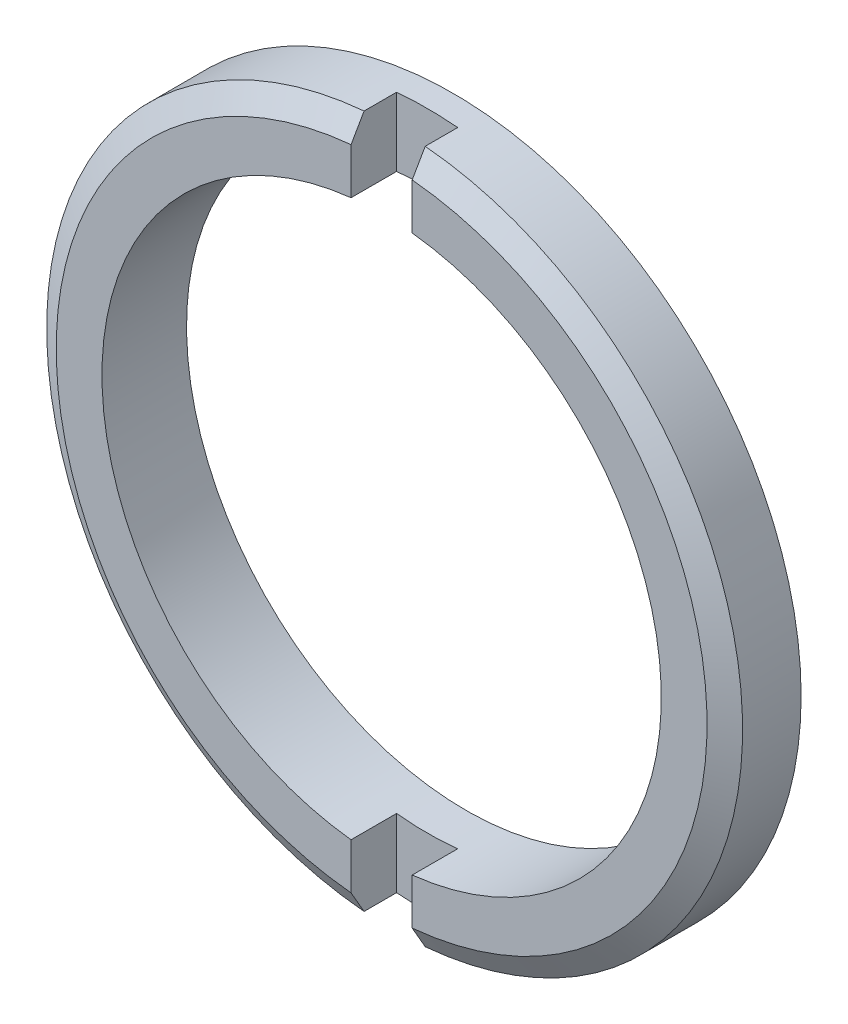
ISO-10303-21;
HEADER;
FILE_DESCRIPTION(('STEP AP214'),'2;1');
FILE_NAME('part.step','',(''),(''),'','','');
FILE_SCHEMA(('AUTOMOTIVE_DESIGN { 1 0 10303 214 1 1 1 1 }'));
ENDSEC;
DATA;
#1=APPLICATION_CONTEXT('core data for automotive mechanical design processes');
#2=APPLICATION_PROTOCOL_DEFINITION('international standard','automotive_design',2000,#1);
#3=PRODUCT_CONTEXT('',#1,'mechanical');
#4=PRODUCT('Part','Part','',(#3));
#5=PRODUCT_RELATED_PRODUCT_CATEGORY('part','',(#4));
#6=PRODUCT_DEFINITION_FORMATION('','',#4);
#7=PRODUCT_DEFINITION_CONTEXT('part definition',#1,'design');
#8=PRODUCT_DEFINITION('design','',#6,#7);
#9=PRODUCT_DEFINITION_SHAPE('','',#8);
#10=(LENGTH_UNIT() NAMED_UNIT(*) SI_UNIT(.MILLI.,.METRE.));
#11=(NAMED_UNIT(*) PLANE_ANGLE_UNIT() SI_UNIT($,.RADIAN.));
#12=(NAMED_UNIT(*) SI_UNIT($,.STERADIAN.) SOLID_ANGLE_UNIT());
#13=UNCERTAINTY_MEASURE_WITH_UNIT(LENGTH_MEASURE(1.E-05),#10,'distance_accuracy_value','');
#14=(GEOMETRIC_REPRESENTATION_CONTEXT(3) GLOBAL_UNCERTAINTY_ASSIGNED_CONTEXT((#13)) GLOBAL_UNIT_ASSIGNED_CONTEXT((#10,
#11,#12)) REPRESENTATION_CONTEXT('',''));
#15=CARTESIAN_POINT('',(0.,0.,0.));
#16=DIRECTION('',(0.,0.,1.));
#17=DIRECTION('',(1.,0.,0.));
#18=AXIS2_PLACEMENT_3D('',#15,#16,#17);
#19=CARTESIAN_POINT('',(-2.00455754003315,-0.12688410129158,1.96948087094969));
#20=DIRECTION('',(0.,0.,1.));
#21=DIRECTION('',(1.,0.,0.));
#22=AXIS2_PLACEMENT_3D('',#19,#20,#21);
#23=PLANE('',#22);
#24=DIRECTION('',(0.,-1.,0.));
#25=VECTOR('',#24,1.);
#26=CARTESIAN_POINT('',(-2.60145754003315,6.64134614301897,1.96948087094969));
#27=LINE('',#26,#25);
#28=CARTESIAN_POINT('',(-2.60145754003315,6.19957870823244,1.96948087094969));
#29=VERTEX_POINT('',#28);
#30=CARTESIAN_POINT('',(-2.60145754003315,5.30139660165664,1.96948087094969));
#31=VERTEX_POINT('',#30);
#32=EDGE_CURVE('E152',#29,#31,#27,.T.);
#33=ORIENTED_EDGE('',*,*,#32,.F.);
#34=CARTESIAN_POINT('',(-2.00455754003315,-0.12688410129158,1.96948087094969));
#35=DIRECTION('',(0.,0.,1.));
#36=DIRECTION('',(1.,0.,0.));
#37=AXIS2_PLACEMENT_3D('',#34,#35,#36);
#38=CIRCLE('',#37,6.35455909487751);
#39=CARTESIAN_POINT('',(-2.60145754003315,-6.4533469108156,1.96948087094969));
#40=VERTEX_POINT('',#39);
#41=EDGE_CURVE('E256',#29,#40,#38,.T.);
#42=ORIENTED_EDGE('',*,*,#41,.T.);
#43=DIRECTION('',(0.,-1.,0.));
#44=VECTOR('',#43,1.);
#45=CARTESIAN_POINT('',(-2.60145754003315,-6.89511434560213,1.96948087094969));
#46=LINE('',#45,#44);
#47=CARTESIAN_POINT('',(-2.60145754003315,-5.5551648042398,1.96948087094969));
#48=VERTEX_POINT('',#47);
#49=EDGE_CURVE('E120',#48,#40,#46,.T.);
#50=ORIENTED_EDGE('',*,*,#49,.F.);
#51=CARTESIAN_POINT('',(-2.00455754003315,-0.12688410129158,1.96948087094969));
#52=DIRECTION('',(0.,0.,1.));
#53=DIRECTION('',(1.,0.,0.));
#54=AXIS2_PLACEMENT_3D('',#51,#52,#53);
#55=CIRCLE('',#54,5.461);
#56=EDGE_CURVE('E173',#31,#48,#55,.T.);
#57=ORIENTED_EDGE('',*,*,#56,.F.);
#58=EDGE_LOOP('',(#33,#42,#50,#57));
#59=FACE_BOUND('',#58,.T.);
#60=ADVANCED_FACE('F16',(#59),#23,.T.);
#61=DIRECTION('',(0.,1.,0.));
#62=VECTOR('',#61,1.);
#63=CARTESIAN_POINT('',(-1.40765754003315,-6.89511434560213,1.96948087094969));
#64=LINE('',#63,#62);
#65=CARTESIAN_POINT('',(-1.40765754003315,-6.4533469108156,1.96948087094969));
#66=VERTEX_POINT('',#65);
#67=CARTESIAN_POINT('',(-1.40765754003315,-5.5551648042398,1.96948087094969));
#68=VERTEX_POINT('',#67);
#69=EDGE_CURVE('E394',#66,#68,#64,.T.);
#70=ORIENTED_EDGE('',*,*,#69,.F.);
#71=CARTESIAN_POINT('',(-2.00455754003315,-0.12688410129158,1.96948087094969));
#72=DIRECTION('',(0.,0.,1.));
#73=DIRECTION('',(1.,0.,0.));
#74=AXIS2_PLACEMENT_3D('',#71,#72,#73);
#75=CIRCLE('',#74,6.35455909487751);
#76=CARTESIAN_POINT('',(-1.40765754003315,6.19957870823244,1.96948087094969));
#77=VERTEX_POINT('',#76);
#78=EDGE_CURVE('E194',#66,#77,#75,.T.);
#79=ORIENTED_EDGE('',*,*,#78,.T.);
#80=DIRECTION('',(0.,1.,0.));
#81=VECTOR('',#80,1.);
#82=CARTESIAN_POINT('',(-1.40765754003315,6.64134614301897,1.96948087094969));
#83=LINE('',#82,#81);
#84=CARTESIAN_POINT('',(-1.40765754003315,5.30139660165664,1.96948087094969));
#85=VERTEX_POINT('',#84);
#86=EDGE_CURVE('E141',#85,#77,#83,.T.);
#87=ORIENTED_EDGE('',*,*,#86,.F.);
#88=EDGE_CURVE('E178',#68,#85,#55,.T.);
#89=ORIENTED_EDGE('',*,*,#88,.F.);
#90=EDGE_LOOP('',(#70,#79,#87,#89));
#91=FACE_BOUND('',#90,.T.);
#92=ADVANCED_FACE('F228',(#91),#23,.T.);
#93=CARTESIAN_POINT('',(-2.00455754003315,-0.12688410129158,0.31848087094969));
#94=DIRECTION('',(0.,0.,1.));
#95=DIRECTION('',(1.,0.,0.));
#96=AXIS2_PLACEMENT_3D('',#93,#94,#95);
#97=PLANE('',#96);
#98=CARTESIAN_POINT('',(-2.00455754003315,-0.12688410129158,0.31848087094969));
#99=DIRECTION('',(0.,0.,1.));
#100=DIRECTION('',(1.,0.,0.));
#101=AXIS2_PLACEMENT_3D('',#98,#99,#100);
#102=CIRCLE('',#101,6.35455909487751);
#103=CARTESIAN_POINT('',(4.35000155484437,-0.12688410129158,0.31848087094969));
#104=VERTEX_POINT('',#103);
#105=EDGE_CURVE('E190',#104,#104,#102,.F.);
#106=ORIENTED_EDGE('',*,*,#105,.T.);
#107=EDGE_LOOP('',(#106));
#108=FACE_BOUND('',#107,.T.);
#109=CARTESIAN_POINT('',(-2.00455754003315,-0.12688410129158,0.31848087094969));
#110=DIRECTION('',(0.,0.,1.));
#111=DIRECTION('',(1.,0.,0.));
#112=AXIS2_PLACEMENT_3D('',#109,#110,#111);
#113=CIRCLE('',#112,5.461);
#114=CARTESIAN_POINT('',(3.45644245996685,-0.12688410129158,0.31848087094969));
#115=VERTEX_POINT('',#114);
#116=EDGE_CURVE('E162',#115,#115,#113,.T.);
#117=ORIENTED_EDGE('',*,*,#116,.T.);
#118=EDGE_LOOP('',(#117));
#119=FACE_BOUND('',#118,.T.);
#120=ADVANCED_FACE('F231',(#108,#119),#97,.F.);
#121=CARTESIAN_POINT('',(-2.00455754003315,-0.12688410129158,1.96948087094969));
#122=DIRECTION('',(0.,0.,-1.));
#123=DIRECTION('',(-1.,0.,0.));
#124=AXIS2_PLACEMENT_3D('',#121,#122,#123);
#125=CYLINDRICAL_SURFACE('',#124,6.7945);
#126=CARTESIAN_POINT('',(-2.00455754003315,-0.12688410129158,0.572480870949685));
#127=DIRECTION('',(0.,0.,1.));
#128=DIRECTION('',(1.,0.,0.));
#129=AXIS2_PLACEMENT_3D('',#126,#127,#128);
#130=CIRCLE('',#129,6.7945);
#131=CARTESIAN_POINT('',(4.78994245996685,-0.12688410129158,0.572480870949685));
#132=VERTEX_POINT('',#131);
#133=EDGE_CURVE('E186',#132,#132,#130,.T.);
#134=ORIENTED_EDGE('',*,*,#133,.T.);
#135=EDGE_LOOP('',(#134));
#136=FACE_BOUND('',#135,.T.);
#137=DIRECTION('',(0.,0.,1.));
#138=VECTOR('',#137,1.);
#139=CARTESIAN_POINT('',(-1.40765754003315,6.64134614301897,1.08048087094969));
#140=LINE('',#139,#138);
#141=CARTESIAN_POINT('',(-1.40765754003315,6.64134614301897,1.08048087094969));
#142=VERTEX_POINT('',#141);
#143=CARTESIAN_POINT('',(-1.40765754003315,6.64134614301897,1.7154808709497));
#144=VERTEX_POINT('',#143);
#145=EDGE_CURVE('E159',#142,#144,#140,.T.);
#146=ORIENTED_EDGE('',*,*,#145,.T.);
#147=CARTESIAN_POINT('',(-2.00455754003315,-0.12688410129158,1.7154808709497));
#148=DIRECTION('',(0.,0.,1.));
#149=DIRECTION('',(1.,0.,0.));
#150=AXIS2_PLACEMENT_3D('',#147,#148,#149);
#151=CIRCLE('',#150,6.7945);
#152=CARTESIAN_POINT('',(-1.40765754003315,-6.89511434560213,1.7154808709497));
#153=VERTEX_POINT('',#152);
#154=EDGE_CURVE('E125',#144,#153,#151,.F.);
#155=ORIENTED_EDGE('',*,*,#154,.T.);
#156=DIRECTION('',(0.,0.,1.));
#157=VECTOR('',#156,1.);
#158=CARTESIAN_POINT('',(-1.40765754003315,-6.89511434560213,1.08048087094969));
#159=LINE('',#158,#157);
#160=CARTESIAN_POINT('',(-1.40765754003315,-6.89511434560213,1.08048087094969));
#161=VERTEX_POINT('',#160);
#162=EDGE_CURVE('E102',#161,#153,#159,.T.);
#163=ORIENTED_EDGE('',*,*,#162,.F.);
#164=CARTESIAN_POINT('',(-2.00455754003315,-0.12688410129158,1.08048087094969));
#165=DIRECTION('',(0.,0.,1.));
#166=DIRECTION('',(1.,0.,0.));
#167=AXIS2_PLACEMENT_3D('',#164,#165,#166);
#168=CIRCLE('',#167,6.7945);
#169=CARTESIAN_POINT('',(-2.60145754003315,-6.89511434560213,1.08048087094969));
#170=VERTEX_POINT('',#169);
#171=EDGE_CURVE('E110',#170,#161,#168,.T.);
#172=ORIENTED_EDGE('',*,*,#171,.F.);
#173=DIRECTION('',(0.,0.,1.));
#174=VECTOR('',#173,1.);
#175=CARTESIAN_POINT('',(-2.60145754003315,-6.89511434560213,1.08048087094969));
#176=LINE('',#175,#174);
#177=CARTESIAN_POINT('',(-2.60145754003315,-6.89511434560213,1.7154808709497));
#178=VERTEX_POINT('',#177);
#179=EDGE_CURVE('E155',#170,#178,#176,.T.);
#180=ORIENTED_EDGE('',*,*,#179,.T.);
#181=CARTESIAN_POINT('',(-2.00455754003315,-0.12688410129158,1.7154808709497));
#182=DIRECTION('',(0.,0.,1.));
#183=DIRECTION('',(1.,0.,0.));
#184=AXIS2_PLACEMENT_3D('',#181,#182,#183);
#185=CIRCLE('',#184,6.7945);
#186=CARTESIAN_POINT('',(-2.60145754003315,6.64134614301897,1.7154808709497));
#187=VERTEX_POINT('',#186);
#188=EDGE_CURVE('E177',#178,#187,#185,.F.);
#189=ORIENTED_EDGE('',*,*,#188,.T.);
#190=DIRECTION('',(0.,0.,1.));
#191=VECTOR('',#190,1.);
#192=CARTESIAN_POINT('',(-2.60145754003315,6.64134614301897,1.08048087094969));
#193=LINE('',#192,#191);
#194=CARTESIAN_POINT('',(-2.60145754003315,6.64134614301897,1.08048087094969));
#195=VERTEX_POINT('',#194);
#196=EDGE_CURVE('E151',#195,#187,#193,.T.);
#197=ORIENTED_EDGE('',*,*,#196,.F.);
#198=CARTESIAN_POINT('',(-2.00455754003315,-0.12688410129158,1.08048087094969));
#199=DIRECTION('',(0.,0.,1.));
#200=DIRECTION('',(1.,0.,0.));
#201=AXIS2_PLACEMENT_3D('',#198,#199,#200);
#202=CIRCLE('',#201,6.7945);
#203=EDGE_CURVE('E136',#142,#195,#202,.T.);
#204=ORIENTED_EDGE('',*,*,#203,.F.);
#205=EDGE_LOOP('',(#146,#155,#163,#172,#180,#189,#197,#204));
#206=FACE_BOUND('',#205,.T.);
#207=ADVANCED_FACE('F123',(#136,#206),#125,.T.);
#208=CARTESIAN_POINT('',(-2.00455754003315,-0.12688410129158,1.96948087094969));
#209=DIRECTION('',(0.,0.,-1.));
#210=DIRECTION('',(-1.,0.,0.));
#211=AXIS2_PLACEMENT_3D('',#208,#209,#210);
#212=CYLINDRICAL_SURFACE('',#211,5.461);
#213=DIRECTION('',(0.,0.,1.));
#214=VECTOR('',#213,1.);
#215=CARTESIAN_POINT('',(-2.60145754003315,-5.5551648042398,1.08048087094969));
#216=LINE('',#215,#214);
#217=CARTESIAN_POINT('',(-2.60145754003315,-5.5551648042398,1.08048087094969));
#218=VERTEX_POINT('',#217);
#219=EDGE_CURVE('E131',#218,#48,#216,.T.);
#220=ORIENTED_EDGE('',*,*,#219,.F.);
#221=CARTESIAN_POINT('',(-2.00455754003315,-0.12688410129158,1.08048087094969));
#222=DIRECTION('',(0.,0.,-1.));
#223=DIRECTION('',(1.,0.,0.));
#224=AXIS2_PLACEMENT_3D('',#221,#222,#223);
#225=CIRCLE('',#224,5.461);
#226=CARTESIAN_POINT('',(-1.40765754003315,-5.5551648042398,1.08048087094969));
#227=VERTEX_POINT('',#226);
#228=EDGE_CURVE('E109',#227,#218,#225,.T.);
#229=ORIENTED_EDGE('',*,*,#228,.F.);
#230=DIRECTION('',(0.,0.,1.));
#231=VECTOR('',#230,1.);
#232=CARTESIAN_POINT('',(-1.40765754003315,-5.5551648042398,1.08048087094969));
#233=LINE('',#232,#231);
#234=EDGE_CURVE('E105',#227,#68,#233,.T.);
#235=ORIENTED_EDGE('',*,*,#234,.T.);
#236=ORIENTED_EDGE('',*,*,#88,.T.);
#237=DIRECTION('',(0.,0.,1.));
#238=VECTOR('',#237,1.);
#239=CARTESIAN_POINT('',(-1.40765754003315,5.30139660165664,1.08048087094969));
#240=LINE('',#239,#238);
#241=CARTESIAN_POINT('',(-1.40765754003315,5.30139660165664,1.08048087094969));
#242=VERTEX_POINT('',#241);
#243=EDGE_CURVE('E163',#242,#85,#240,.T.);
#244=ORIENTED_EDGE('',*,*,#243,.F.);
#245=CARTESIAN_POINT('',(-2.00455754003315,-0.12688410129158,1.08048087094969));
#246=DIRECTION('',(0.,0.,-1.));
#247=DIRECTION('',(1.,0.,0.));
#248=AXIS2_PLACEMENT_3D('',#245,#246,#247);
#249=CIRCLE('',#248,5.461);
#250=CARTESIAN_POINT('',(-2.60145754003315,5.30139660165664,1.08048087094969));
#251=VERTEX_POINT('',#250);
#252=EDGE_CURVE('E144',#251,#242,#249,.T.);
#253=ORIENTED_EDGE('',*,*,#252,.F.);
#254=DIRECTION('',(0.,0.,1.));
#255=VECTOR('',#254,1.);
#256=CARTESIAN_POINT('',(-2.60145754003315,5.30139660165664,1.08048087094969));
#257=LINE('',#256,#255);
#258=EDGE_CURVE('E167',#251,#31,#257,.T.);
#259=ORIENTED_EDGE('',*,*,#258,.T.);
#260=ORIENTED_EDGE('',*,*,#56,.T.);
#261=EDGE_LOOP('',(#220,#229,#235,#236,#244,#253,#259,#260));
#262=FACE_BOUND('',#261,.T.);
#263=ORIENTED_EDGE('',*,*,#116,.F.);
#264=EDGE_LOOP('',(#263));
#265=FACE_BOUND('',#264,.T.);
#266=ADVANCED_FACE('F219',(#262,#265),#212,.F.);
#267=CARTESIAN_POINT('',(-1.40765754003315,6.64134614301897,1.08048087094969));
#268=DIRECTION('',(1.,0.,0.));
#269=DIRECTION('',(0.,1.,0.));
#270=AXIS2_PLACEMENT_3D('',#267,#268,#269);
#271=PLANE('',#270);
#272=ORIENTED_EDGE('',*,*,#86,.T.);
#273=CARTESIAN_POINT('',(-1.40765754003315,6.19957870823244,1.96948087094969));
#274=CARTESIAN_POINT('',(-1.40765754003315,6.27321170668875,1.92715639496072));
#275=CARTESIAN_POINT('',(-1.40765754003315,6.34684215882024,1.88482749029701));
#276=CARTESIAN_POINT('',(-1.40765754003315,6.49409797041575,1.80016082363034));
#277=CARTESIAN_POINT('',(-1.40765754003315,6.56772332987977,1.75782306162739));
#278=CARTESIAN_POINT('',(-1.40765754003315,6.64134614301897,1.7154808709497));
#279=B_SPLINE_CURVE_WITH_KNOTS('',3,(#273,#274,#275,#276,#277,#278),.UNSPECIFIED.,.F.,.F.,(4,2,
4),(0.,0.254791320221188,0.509582640380692),.UNSPECIFIED.);
#280=EDGE_CURVE('E198',#77,#144,#279,.T.);
#281=ORIENTED_EDGE('',*,*,#280,.T.);
#282=ORIENTED_EDGE('',*,*,#145,.F.);
#283=DIRECTION('',(0.,1.,0.));
#284=VECTOR('',#283,1.);
#285=CARTESIAN_POINT('',(-1.40765754003315,6.64134614301897,1.08048087094969));
#286=LINE('',#285,#284);
#287=EDGE_CURVE('E147',#242,#142,#286,.T.);
#288=ORIENTED_EDGE('',*,*,#287,.F.);
#289=ORIENTED_EDGE('',*,*,#243,.T.);
#290=EDGE_LOOP('',(#272,#281,#282,#288,#289));
#291=FACE_BOUND('',#290,.T.);
#292=ADVANCED_FACE('F214',(#291),#271,.F.);
#293=CARTESIAN_POINT('',(-2.60145754003315,6.64134614301897,1.08048087094969));
#294=DIRECTION('',(-1.,0.,0.));
#295=DIRECTION('',(0.,-1.,0.));
#296=AXIS2_PLACEMENT_3D('',#293,#294,#295);
#297=PLANE('',#296);
#298=ORIENTED_EDGE('',*,*,#196,.T.);
#299=CARTESIAN_POINT('',(-2.60145754003315,6.64134614301897,1.7154808709497));
#300=CARTESIAN_POINT('',(-2.60145754003315,6.56772332987977,1.75782306162739));
#301=CARTESIAN_POINT('',(-2.60145754003315,6.49409797041575,1.80016082363034));
#302=CARTESIAN_POINT('',(-2.60145754003315,6.34684215882024,1.88482749029701));
#303=CARTESIAN_POINT('',(-2.60145754003315,6.27321170668875,1.92715639496072));
#304=CARTESIAN_POINT('',(-2.60145754003315,6.19957870823244,1.96948087094969));
#305=B_SPLINE_CURVE_WITH_KNOTS('',3,(#299,#300,#301,#302,#303,#304),.UNSPECIFIED.,.F.,.F.,(4,2,
4),(0.,0.254791320159504,0.509582640380692),.UNSPECIFIED.);
#306=EDGE_CURVE('E11',#187,#29,#305,.T.);
#307=ORIENTED_EDGE('',*,*,#306,.T.);
#308=ORIENTED_EDGE('',*,*,#32,.T.);
#309=ORIENTED_EDGE('',*,*,#258,.F.);
#310=DIRECTION('',(0.,-1.,0.));
#311=VECTOR('',#310,1.);
#312=CARTESIAN_POINT('',(-2.60145754003315,6.64134614301897,1.08048087094969));
#313=LINE('',#312,#311);
#314=EDGE_CURVE('E140',#195,#251,#313,.T.);
#315=ORIENTED_EDGE('',*,*,#314,.F.);
#316=EDGE_LOOP('',(#298,#307,#308,#309,#315));
#317=FACE_BOUND('',#316,.T.);
#318=ADVANCED_FACE('F218',(#317),#297,.F.);
#319=CARTESIAN_POINT('',(-2.00455754003315,-0.12688410129158,1.08048087094969));
#320=DIRECTION('',(0.,0.,1.));
#321=DIRECTION('',(1.,0.,0.));
#322=AXIS2_PLACEMENT_3D('',#319,#320,#321);
#323=PLANE('',#322);
#324=ORIENTED_EDGE('',*,*,#203,.T.);
#325=ORIENTED_EDGE('',*,*,#314,.T.);
#326=ORIENTED_EDGE('',*,*,#252,.T.);
#327=ORIENTED_EDGE('',*,*,#287,.T.);
#328=EDGE_LOOP('',(#324,#325,#326,#327));
#329=FACE_BOUND('',#328,.T.);
#330=ADVANCED_FACE('F221',(#329),#323,.T.);
#331=CARTESIAN_POINT('',(-2.60145754003315,-6.89511434560213,1.08048087094969));
#332=DIRECTION('',(-1.,0.,0.));
#333=DIRECTION('',(0.,-1.,0.));
#334=AXIS2_PLACEMENT_3D('',#331,#332,#333);
#335=PLANE('',#334);
#336=ORIENTED_EDGE('',*,*,#49,.T.);
#337=CARTESIAN_POINT('',(-2.60145754003315,-6.4533469108156,1.96948087094969));
#338=CARTESIAN_POINT('',(-2.60145754003315,-6.52697990927191,1.92715639496072));
#339=CARTESIAN_POINT('',(-2.60145754003315,-6.6006103614034,1.88482749029701));
#340=CARTESIAN_POINT('',(-2.60145754003315,-6.74786617299891,1.80016082363034));
#341=CARTESIAN_POINT('',(-2.60145754003315,-6.82149153246293,1.75782306162739));
#342=CARTESIAN_POINT('',(-2.60145754003315,-6.89511434560213,1.7154808709497));
#343=B_SPLINE_CURVE_WITH_KNOTS('',3,(#337,#338,#339,#340,#341,#342),.UNSPECIFIED.,.F.,.F.,(4,2,
4),(0.,0.254791320221188,0.509582640380692),.UNSPECIFIED.);
#344=EDGE_CURVE('E30',#40,#178,#343,.T.);
#345=ORIENTED_EDGE('',*,*,#344,.T.);
#346=ORIENTED_EDGE('',*,*,#179,.F.);
#347=DIRECTION('',(0.,-1.,0.));
#348=VECTOR('',#347,1.);
#349=CARTESIAN_POINT('',(-2.60145754003315,-6.89511434560213,1.08048087094969));
#350=LINE('',#349,#348);
#351=EDGE_CURVE('E116',#218,#170,#350,.T.);
#352=ORIENTED_EDGE('',*,*,#351,.F.);
#353=ORIENTED_EDGE('',*,*,#219,.T.);
#354=EDGE_LOOP('',(#336,#345,#346,#352,#353));
#355=FACE_BOUND('',#354,.T.);
#356=ADVANCED_FACE('F266',(#355),#335,.F.);
#357=CARTESIAN_POINT('',(-1.40765754003315,-6.89511434560213,1.08048087094969));
#358=DIRECTION('',(1.,0.,0.));
#359=DIRECTION('',(0.,1.,0.));
#360=AXIS2_PLACEMENT_3D('',#357,#358,#359);
#361=PLANE('',#360);
#362=ORIENTED_EDGE('',*,*,#162,.T.);
#363=CARTESIAN_POINT('',(-1.40765754003315,-6.89511434560213,1.7154808709497));
#364=CARTESIAN_POINT('',(-1.40765754003315,-6.82149153246293,1.75782306162739));
#365=CARTESIAN_POINT('',(-1.40765754003315,-6.74786617299891,1.80016082363034));
#366=CARTESIAN_POINT('',(-1.40765754003315,-6.6006103614034,1.88482749029701));
#367=CARTESIAN_POINT('',(-1.40765754003315,-6.52697990927191,1.92715639496072));
#368=CARTESIAN_POINT('',(-1.40765754003315,-6.4533469108156,1.96948087094969));
#369=B_SPLINE_CURVE_WITH_KNOTS('',3,(#363,#364,#365,#366,#367,#368),.UNSPECIFIED.,.F.,.F.,(4,2,
4),(0.,0.254791320159504,0.509582640380692),.UNSPECIFIED.);
#370=EDGE_CURVE('E205',#153,#66,#369,.T.);
#371=ORIENTED_EDGE('',*,*,#370,.T.);
#372=ORIENTED_EDGE('',*,*,#69,.T.);
#373=ORIENTED_EDGE('',*,*,#234,.F.);
#374=DIRECTION('',(0.,1.,0.));
#375=VECTOR('',#374,1.);
#376=CARTESIAN_POINT('',(-1.40765754003315,-6.89511434560213,1.08048087094969));
#377=LINE('',#376,#375);
#378=EDGE_CURVE('E98',#161,#227,#377,.T.);
#379=ORIENTED_EDGE('',*,*,#378,.F.);
#380=EDGE_LOOP('',(#362,#371,#372,#373,#379));
#381=FACE_BOUND('',#380,.T.);
#382=ADVANCED_FACE('F100',(#381),#361,.F.);
#383=CARTESIAN_POINT('',(-2.00455754003315,-0.12688410129158,1.08048087094969));
#384=DIRECTION('',(0.,0.,1.));
#385=DIRECTION('',(1.,0.,0.));
#386=AXIS2_PLACEMENT_3D('',#383,#384,#385);
#387=PLANE('',#386);
#388=ORIENTED_EDGE('',*,*,#171,.T.);
#389=ORIENTED_EDGE('',*,*,#378,.T.);
#390=ORIENTED_EDGE('',*,*,#228,.T.);
#391=ORIENTED_EDGE('',*,*,#351,.T.);
#392=EDGE_LOOP('',(#388,#389,#390,#391));
#393=FACE_BOUND('',#392,.T.);
#394=ADVANCED_FACE('F114',(#393),#387,.T.);
#395=CARTESIAN_POINT('',(-2.00455754003315,-0.12688410129158,0.572480870949685));
#396=DIRECTION('',(0.,0.,1.));
#397=DIRECTION('',(1.,0.,0.));
#398=AXIS2_PLACEMENT_3D('',#395,#396,#397);
#399=CONICAL_SURFACE('',#398,6.7945,1.0471975511966);
#400=ORIENTED_EDGE('',*,*,#105,.F.);
#401=EDGE_LOOP('',(#400));
#402=FACE_BOUND('',#401,.T.);
#403=ORIENTED_EDGE('',*,*,#133,.F.);
#404=EDGE_LOOP('',(#403));
#405=FACE_BOUND('',#404,.T.);
#406=ADVANCED_FACE('F238',(#402,#405),#399,.T.);
#407=CARTESIAN_POINT('',(-2.00455754003315,-0.12688410129158,1.96948087094969));
#408=DIRECTION('',(0.,0.,-1.));
#409=DIRECTION('',(-1.,0.,0.));
#410=AXIS2_PLACEMENT_3D('',#407,#408,#409);
#411=CONICAL_SURFACE('',#410,6.35455909487751,1.0471975511966);
#412=ORIENTED_EDGE('',*,*,#370,.F.);
#413=ORIENTED_EDGE('',*,*,#154,.F.);
#414=ORIENTED_EDGE('',*,*,#280,.F.);
#415=ORIENTED_EDGE('',*,*,#78,.F.);
#416=EDGE_LOOP('',(#412,#413,#414,#415));
#417=FACE_BOUND('',#416,.T.);
#418=ADVANCED_FACE('F211',(#417),#411,.T.);
#419=CARTESIAN_POINT('',(-2.00455754003315,-0.12688410129158,1.96948087094969));
#420=DIRECTION('',(0.,0.,-1.));
#421=DIRECTION('',(-1.,0.,0.));
#422=AXIS2_PLACEMENT_3D('',#419,#420,#421);
#423=CONICAL_SURFACE('',#422,6.35455909487751,1.0471975511966);
#424=ORIENTED_EDGE('',*,*,#306,.F.);
#425=ORIENTED_EDGE('',*,*,#188,.F.);
#426=ORIENTED_EDGE('',*,*,#344,.F.);
#427=ORIENTED_EDGE('',*,*,#41,.F.);
#428=EDGE_LOOP('',(#424,#425,#426,#427));
#429=FACE_BOUND('',#428,.T.);
#430=ADVANCED_FACE('F18',(#429),#423,.T.);
#431=CLOSED_SHELL('',(#60,#92,#120,#207,#266,#292,#318,#330,#356,#382,#394,#406,#418,#430));
#432=MANIFOLD_SOLID_BREP('B1',#431);
#433=ADVANCED_BREP_SHAPE_REPRESENTATION('',(#18,#432),#14);
#434=SHAPE_DEFINITION_REPRESENTATION(#9,#433);
ENDSEC;
END-ISO-10303-21;
